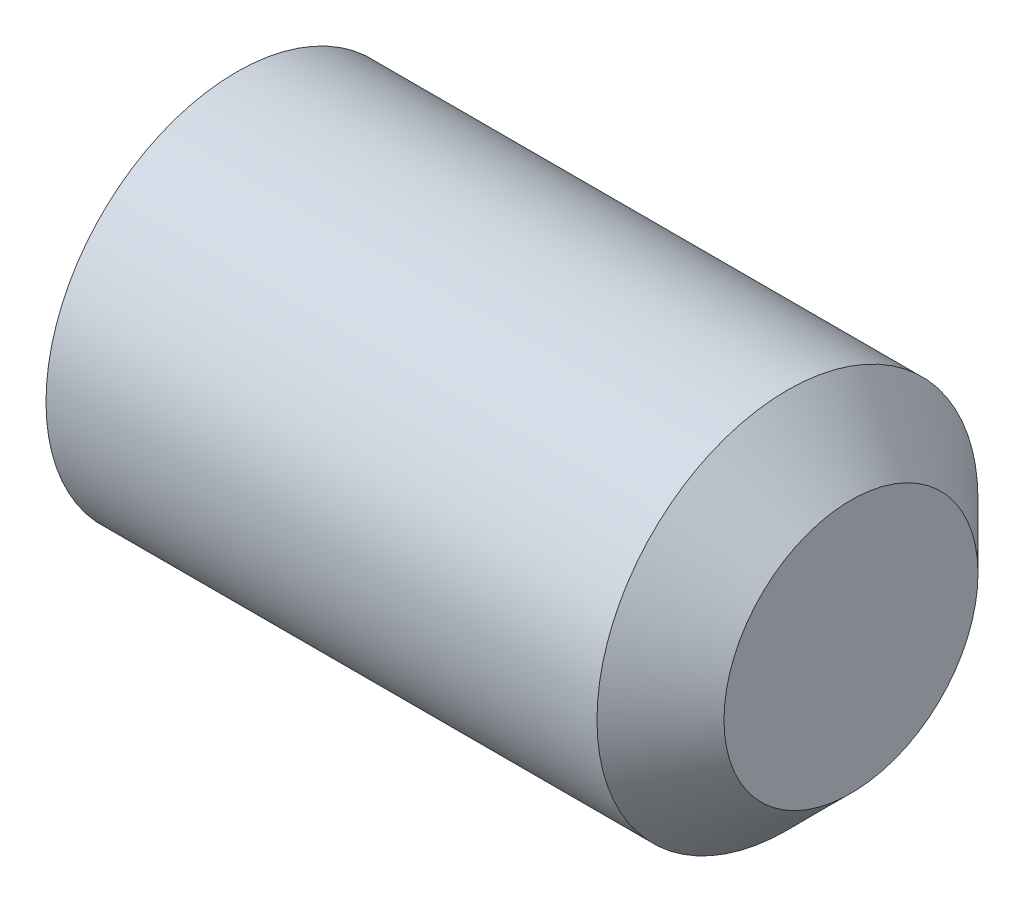
ISO-10303-21;
HEADER;
FILE_DESCRIPTION(('STEP AP214'),'2;1');
FILE_NAME('part.step','',(''),(''),'','','');
FILE_SCHEMA(('AUTOMOTIVE_DESIGN { 1 0 10303 214 1 1 1 1 }'));
ENDSEC;
DATA;
#1=APPLICATION_CONTEXT('core data for automotive mechanical design processes');
#2=APPLICATION_PROTOCOL_DEFINITION('international standard','automotive_design',2000,#1);
#3=PRODUCT_CONTEXT('',#1,'mechanical');
#4=PRODUCT('Part','Part','',(#3));
#5=PRODUCT_RELATED_PRODUCT_CATEGORY('part','',(#4));
#6=PRODUCT_DEFINITION_FORMATION('','',#4);
#7=PRODUCT_DEFINITION_CONTEXT('part definition',#1,'design');
#8=PRODUCT_DEFINITION('design','',#6,#7);
#9=PRODUCT_DEFINITION_SHAPE('','',#8);
#10=(LENGTH_UNIT() NAMED_UNIT(*) SI_UNIT(.MILLI.,.METRE.));
#11=(NAMED_UNIT(*) PLANE_ANGLE_UNIT() SI_UNIT($,.RADIAN.));
#12=(NAMED_UNIT(*) SI_UNIT($,.STERADIAN.) SOLID_ANGLE_UNIT());
#13=UNCERTAINTY_MEASURE_WITH_UNIT(LENGTH_MEASURE(1.E-05),#10,'distance_accuracy_value','');
#14=(GEOMETRIC_REPRESENTATION_CONTEXT(3) GLOBAL_UNCERTAINTY_ASSIGNED_CONTEXT((#13)) GLOBAL_UNIT_ASSIGNED_CONTEXT((#10,
#11,#12)) REPRESENTATION_CONTEXT('',''));
#15=CARTESIAN_POINT('',(0.,0.,0.));
#16=DIRECTION('',(0.,0.,1.));
#17=DIRECTION('',(1.,0.,0.));
#18=AXIS2_PLACEMENT_3D('',#15,#16,#17);
#19=CARTESIAN_POINT('',(0.,0.,0.));
#20=DIRECTION('',(-1.,0.,0.));
#21=DIRECTION('',(0.,0.,1.));
#22=AXIS2_PLACEMENT_3D('',#19,#20,#21);
#23=PLANE('',#22);
#24=CARTESIAN_POINT('',(0.,0.,0.));
#25=DIRECTION('',(-1.,0.,0.));
#26=DIRECTION('',(0.,0.,1.));
#27=AXIS2_PLACEMENT_3D('',#24,#25,#26);
#28=CIRCLE('',#27,1.2195);
#29=CARTESIAN_POINT('',(0.,0.,1.2195));
#30=VERTEX_POINT('',#29);
#31=EDGE_CURVE('E136',#30,#30,#28,.T.);
#32=ORIENTED_EDGE('',*,*,#31,.T.);
#33=EDGE_LOOP('',(#32));
#34=FACE_BOUND('',#33,.T.);
#35=DIRECTION('',(0.,0.,-1.));
#36=VECTOR('',#35,1.);
#37=CARTESIAN_POINT('',(0.,0.750000000000004,0.433012701892216));
#38=LINE('',#37,#36);
#39=CARTESIAN_POINT('',(0.,0.750000000000004,0.433012701892216));
#40=VERTEX_POINT('',#39);
#41=CARTESIAN_POINT('',(0.,0.750000000000003,-0.433012701892223));
#42=VERTEX_POINT('',#41);
#43=EDGE_CURVE('E127',#40,#42,#38,.T.);
#44=ORIENTED_EDGE('',*,*,#43,.F.);
#45=DIRECTION('',(0.,-0.866025403784438,0.5));
#46=VECTOR('',#45,1.);
#47=CARTESIAN_POINT('',(0.,0.750000000000004,0.433012701892216));
#48=LINE('',#47,#46);
#49=CARTESIAN_POINT('',(0.,0.,0.866025403784436));
#50=VERTEX_POINT('',#49);
#51=EDGE_CURVE('E49',#40,#50,#48,.T.);
#52=ORIENTED_EDGE('',*,*,#51,.T.);
#53=DIRECTION('',(0.,0.866025403784439,0.5));
#54=VECTOR('',#53,1.);
#55=CARTESIAN_POINT('',(0.,-0.749999999999997,0.433012701892217));
#56=LINE('',#55,#54);
#57=CARTESIAN_POINT('',(0.,-0.749999999999997,0.433012701892217));
#58=VERTEX_POINT('',#57);
#59=EDGE_CURVE('E118',#58,#50,#56,.T.);
#60=ORIENTED_EDGE('',*,*,#59,.F.);
#61=DIRECTION('',(0.,0.,-1.));
#62=VECTOR('',#61,1.);
#63=CARTESIAN_POINT('',(0.,-0.749999999999997,0.433012701892217));
#64=LINE('',#63,#62);
#65=CARTESIAN_POINT('',(0.,-0.749999999999997,-0.433012701892222));
#66=VERTEX_POINT('',#65);
#67=EDGE_CURVE('E121',#58,#66,#64,.T.);
#68=ORIENTED_EDGE('',*,*,#67,.T.);
#69=DIRECTION('',(0.,0.866025403784438,-0.5));
#70=VECTOR('',#69,1.);
#71=CARTESIAN_POINT('',(0.,-0.749999999999997,-0.433012701892222));
#72=LINE('',#71,#70);
#73=CARTESIAN_POINT('',(0.,0.,-0.866025403784442));
#74=VERTEX_POINT('',#73);
#75=EDGE_CURVE('E124',#66,#74,#72,.T.);
#76=ORIENTED_EDGE('',*,*,#75,.T.);
#77=DIRECTION('',(0.,-0.866025403784439,-0.5));
#78=VECTOR('',#77,1.);
#79=CARTESIAN_POINT('',(0.,0.750000000000003,-0.433012701892223));
#80=LINE('',#79,#78);
#81=EDGE_CURVE('E107',#42,#74,#80,.T.);
#82=ORIENTED_EDGE('',*,*,#81,.F.);
#83=EDGE_LOOP('',(#44,#52,#60,#68,#76,#82));
#84=FACE_BOUND('',#83,.T.);
#85=ADVANCED_FACE('F34',(#34,#84),#23,.T.);
#86=CARTESIAN_POINT('',(5.,1.,0.));
#87=DIRECTION('',(1.,0.,0.));
#88=DIRECTION('',(0.,0.,-1.));
#89=AXIS2_PLACEMENT_3D('',#86,#87,#88);
#90=PLANE('',#89);
#91=CARTESIAN_POINT('',(5.,0.,0.));
#92=DIRECTION('',(-1.,0.,0.));
#93=DIRECTION('',(0.,0.,1.));
#94=AXIS2_PLACEMENT_3D('',#91,#92,#93);
#95=CIRCLE('',#94,1.);
#96=CARTESIAN_POINT('',(5.,0.,1.));
#97=VERTEX_POINT('',#96);
#98=EDGE_CURVE('E11',#97,#97,#95,.T.);
#99=ORIENTED_EDGE('',*,*,#98,.F.);
#100=EDGE_LOOP('',(#99));
#101=FACE_BOUND('',#100,.T.);
#102=ADVANCED_FACE('F36',(#101),#90,.T.);
#103=CARTESIAN_POINT('',(4.5,0.,0.));
#104=DIRECTION('',(-1.,0.,0.));
#105=DIRECTION('',(0.,0.,1.));
#106=AXIS2_PLACEMENT_3D('',#103,#104,#105);
#107=CONICAL_SURFACE('',#106,1.5,0.785398163397452);
#108=ORIENTED_EDGE('',*,*,#98,.T.);
#109=EDGE_LOOP('',(#108));
#110=FACE_BOUND('',#109,.T.);
#111=CARTESIAN_POINT('',(4.5,0.,0.));
#112=DIRECTION('',(-1.,0.,0.));
#113=DIRECTION('',(0.,0.,1.));
#114=AXIS2_PLACEMENT_3D('',#111,#112,#113);
#115=CIRCLE('',#114,1.5);
#116=CARTESIAN_POINT('',(4.5,0.,1.5));
#117=VERTEX_POINT('',#116);
#118=EDGE_CURVE('E42',#117,#117,#115,.T.);
#119=ORIENTED_EDGE('',*,*,#118,.F.);
#120=EDGE_LOOP('',(#119));
#121=FACE_BOUND('',#120,.T.);
#122=ADVANCED_FACE('F147',(#110,#121),#107,.T.);
#123=CARTESIAN_POINT('',(-12.7,0.,0.));
#124=DIRECTION('',(-1.,0.,0.));
#125=DIRECTION('',(0.,0.,1.));
#126=AXIS2_PLACEMENT_3D('',#123,#124,#125);
#127=CYLINDRICAL_SURFACE('',#126,1.5);
#128=ORIENTED_EDGE('',*,*,#118,.T.);
#129=EDGE_LOOP('',(#128));
#130=FACE_BOUND('',#129,.T.);
#131=CARTESIAN_POINT('',(0.161946750507689,0.,0.));
#132=DIRECTION('',(-1.,0.,0.));
#133=DIRECTION('',(0.,0.,1.));
#134=AXIS2_PLACEMENT_3D('',#131,#132,#133);
#135=CIRCLE('',#134,1.5);
#136=CARTESIAN_POINT('',(0.161946750507689,0.,1.5));
#137=VERTEX_POINT('',#136);
#138=EDGE_CURVE('E139',#137,#137,#135,.T.);
#139=ORIENTED_EDGE('',*,*,#138,.F.);
#140=EDGE_LOOP('',(#139));
#141=FACE_BOUND('',#140,.T.);
#142=ADVANCED_FACE('F144',(#130,#141),#127,.T.);
#143=CARTESIAN_POINT('',(0.,0.,0.));
#144=DIRECTION('',(1.,0.,0.));
#145=DIRECTION('',(0.,0.,-1.));
#146=AXIS2_PLACEMENT_3D('',#143,#144,#145);
#147=CONICAL_SURFACE('',#146,1.2195,1.0471975511966);
#148=ORIENTED_EDGE('',*,*,#138,.T.);
#149=EDGE_LOOP('',(#148));
#150=FACE_BOUND('',#149,.T.);
#151=ORIENTED_EDGE('',*,*,#31,.F.);
#152=EDGE_LOOP('',(#151));
#153=FACE_BOUND('',#152,.T.);
#154=ADVANCED_FACE('F154',(#150,#153),#147,.T.);
#155=CARTESIAN_POINT('',(2.1,0.750000000000004,0.433012701892216));
#156=DIRECTION('',(0.,-0.5,-0.866025403784438));
#157=DIRECTION('',(0.,0.866025403784438,-0.5));
#158=AXIS2_PLACEMENT_3D('',#155,#156,#157);
#159=PLANE('',#158);
#160=ORIENTED_EDGE('',*,*,#51,.F.);
#161=DIRECTION('',(-1.,0.,0.));
#162=VECTOR('',#161,1.);
#163=CARTESIAN_POINT('',(2.1,0.750000000000004,0.433012701892216));
#164=LINE('',#163,#162);
#165=CARTESIAN_POINT('',(2.1,0.750000000000004,0.433012701892216));
#166=VERTEX_POINT('',#165);
#167=EDGE_CURVE('E54',#166,#40,#164,.T.);
#168=ORIENTED_EDGE('',*,*,#167,.F.);
#169=DIRECTION('',(0.,-0.866025403784438,0.5));
#170=VECTOR('',#169,1.);
#171=CARTESIAN_POINT('',(2.1,0.750000000000004,0.433012701892216));
#172=LINE('',#171,#170);
#173=CARTESIAN_POINT('',(2.1,0.,0.866025403784436));
#174=VERTEX_POINT('',#173);
#175=EDGE_CURVE('E81',#166,#174,#172,.T.);
#176=ORIENTED_EDGE('',*,*,#175,.T.);
#177=DIRECTION('',(-1.,0.,0.));
#178=VECTOR('',#177,1.);
#179=CARTESIAN_POINT('',(2.1,0.,0.866025403784436));
#180=LINE('',#179,#178);
#181=EDGE_CURVE('E134',#174,#50,#180,.T.);
#182=ORIENTED_EDGE('',*,*,#181,.T.);
#183=EDGE_LOOP('',(#160,#168,#176,#182));
#184=FACE_BOUND('',#183,.T.);
#185=ADVANCED_FACE('F165',(#184),#159,.T.);
#186=CARTESIAN_POINT('',(2.1,-0.749999999999997,0.433012701892217));
#187=DIRECTION('',(0.,-0.5,0.866025403784439));
#188=DIRECTION('',(0.,-0.866025403784439,-0.5));
#189=AXIS2_PLACEMENT_3D('',#186,#187,#188);
#190=PLANE('',#189);
#191=ORIENTED_EDGE('',*,*,#59,.T.);
#192=ORIENTED_EDGE('',*,*,#181,.F.);
#193=DIRECTION('',(0.,0.866025403784439,0.5));
#194=VECTOR('',#193,1.);
#195=CARTESIAN_POINT('',(2.1,-0.749999999999997,0.433012701892217));
#196=LINE('',#195,#194);
#197=CARTESIAN_POINT('',(2.1,-0.749999999999997,0.433012701892217));
#198=VERTEX_POINT('',#197);
#199=EDGE_CURVE('E269',#198,#174,#196,.T.);
#200=ORIENTED_EDGE('',*,*,#199,.F.);
#201=DIRECTION('',(-1.,0.,0.));
#202=VECTOR('',#201,1.);
#203=CARTESIAN_POINT('',(2.1,-0.749999999999997,0.433012701892217));
#204=LINE('',#203,#202);
#205=EDGE_CURVE('E132',#198,#58,#204,.T.);
#206=ORIENTED_EDGE('',*,*,#205,.T.);
#207=EDGE_LOOP('',(#191,#192,#200,#206));
#208=FACE_BOUND('',#207,.T.);
#209=ADVANCED_FACE('F172',(#208),#190,.F.);
#210=CARTESIAN_POINT('',(2.1,-0.749999999999997,0.433012701892217));
#211=DIRECTION('',(0.,1.,0.));
#212=DIRECTION('',(0.,0.,1.));
#213=AXIS2_PLACEMENT_3D('',#210,#211,#212);
#214=PLANE('',#213);
#215=ORIENTED_EDGE('',*,*,#67,.F.);
#216=ORIENTED_EDGE('',*,*,#205,.F.);
#217=DIRECTION('',(0.,0.,-1.));
#218=VECTOR('',#217,1.);
#219=CARTESIAN_POINT('',(2.1,-0.749999999999997,0.433012701892217));
#220=LINE('',#219,#218);
#221=CARTESIAN_POINT('',(2.1,-0.749999999999997,-0.433012701892222));
#222=VERTEX_POINT('',#221);
#223=EDGE_CURVE('E102',#198,#222,#220,.T.);
#224=ORIENTED_EDGE('',*,*,#223,.T.);
#225=DIRECTION('',(-1.,0.,0.));
#226=VECTOR('',#225,1.);
#227=CARTESIAN_POINT('',(2.1,-0.749999999999997,-0.433012701892222));
#228=LINE('',#227,#226);
#229=EDGE_CURVE('E97',#222,#66,#228,.T.);
#230=ORIENTED_EDGE('',*,*,#229,.T.);
#231=EDGE_LOOP('',(#215,#216,#224,#230));
#232=FACE_BOUND('',#231,.T.);
#233=ADVANCED_FACE('F179',(#232),#214,.T.);
#234=CARTESIAN_POINT('',(2.1,-0.749999999999997,-0.433012701892222));
#235=DIRECTION('',(0.,0.5,0.866025403784438));
#236=DIRECTION('',(0.,-0.866025403784438,0.5));
#237=AXIS2_PLACEMENT_3D('',#234,#235,#236);
#238=PLANE('',#237);
#239=ORIENTED_EDGE('',*,*,#75,.F.);
#240=ORIENTED_EDGE('',*,*,#229,.F.);
#241=DIRECTION('',(0.,0.866025403784438,-0.5));
#242=VECTOR('',#241,1.);
#243=CARTESIAN_POINT('',(2.1,-0.749999999999997,-0.433012701892222));
#244=LINE('',#243,#242);
#245=CARTESIAN_POINT('',(2.1,0.,-0.866025403784442));
#246=VERTEX_POINT('',#245);
#247=EDGE_CURVE('E92',#222,#246,#244,.T.);
#248=ORIENTED_EDGE('',*,*,#247,.T.);
#249=DIRECTION('',(-1.,0.,0.));
#250=VECTOR('',#249,1.);
#251=CARTESIAN_POINT('',(2.1,0.,-0.866025403784442));
#252=LINE('',#251,#250);
#253=EDGE_CURVE('E96',#246,#74,#252,.T.);
#254=ORIENTED_EDGE('',*,*,#253,.T.);
#255=EDGE_LOOP('',(#239,#240,#248,#254));
#256=FACE_BOUND('',#255,.T.);
#257=ADVANCED_FACE('F95',(#256),#238,.T.);
#258=CARTESIAN_POINT('',(2.1,0.750000000000003,-0.433012701892223));
#259=DIRECTION('',(0.,0.5,-0.866025403784439));
#260=DIRECTION('',(0.,0.866025403784439,0.5));
#261=AXIS2_PLACEMENT_3D('',#258,#259,#260);
#262=PLANE('',#261);
#263=ORIENTED_EDGE('',*,*,#81,.T.);
#264=ORIENTED_EDGE('',*,*,#253,.F.);
#265=DIRECTION('',(0.,-0.866025403784439,-0.5));
#266=VECTOR('',#265,1.);
#267=CARTESIAN_POINT('',(2.1,0.750000000000003,-0.433012701892223));
#268=LINE('',#267,#266);
#269=CARTESIAN_POINT('',(2.1,0.750000000000003,-0.433012701892223));
#270=VERTEX_POINT('',#269);
#271=EDGE_CURVE('E101',#270,#246,#268,.T.);
#272=ORIENTED_EDGE('',*,*,#271,.F.);
#273=DIRECTION('',(-1.,0.,0.));
#274=VECTOR('',#273,1.);
#275=CARTESIAN_POINT('',(2.1,0.750000000000003,-0.433012701892223));
#276=LINE('',#275,#274);
#277=EDGE_CURVE('E77',#270,#42,#276,.T.);
#278=ORIENTED_EDGE('',*,*,#277,.T.);
#279=EDGE_LOOP('',(#263,#264,#272,#278));
#280=FACE_BOUND('',#279,.T.);
#281=ADVANCED_FACE('F104',(#280),#262,.F.);
#282=CARTESIAN_POINT('',(2.1,0.750000000000004,0.433012701892216));
#283=DIRECTION('',(0.,1.,0.));
#284=DIRECTION('',(0.,0.,1.));
#285=AXIS2_PLACEMENT_3D('',#282,#283,#284);
#286=PLANE('',#285);
#287=ORIENTED_EDGE('',*,*,#43,.T.);
#288=ORIENTED_EDGE('',*,*,#277,.F.);
#289=DIRECTION('',(0.,0.,-1.));
#290=VECTOR('',#289,1.);
#291=CARTESIAN_POINT('',(2.1,0.750000000000004,0.433012701892216));
#292=LINE('',#291,#290);
#293=EDGE_CURVE('E112',#166,#270,#292,.T.);
#294=ORIENTED_EDGE('',*,*,#293,.F.);
#295=ORIENTED_EDGE('',*,*,#167,.T.);
#296=EDGE_LOOP('',(#287,#288,#294,#295));
#297=FACE_BOUND('',#296,.T.);
#298=ADVANCED_FACE('F191',(#297),#286,.F.);
#299=CARTESIAN_POINT('',(2.1,1.5,0.));
#300=DIRECTION('',(1.,0.,0.));
#301=DIRECTION('',(0.,0.,-1.));
#302=AXIS2_PLACEMENT_3D('',#299,#300,#301);
#303=PLANE('',#302);
#304=ORIENTED_EDGE('',*,*,#175,.F.);
#305=ORIENTED_EDGE('',*,*,#293,.T.);
#306=ORIENTED_EDGE('',*,*,#271,.T.);
#307=ORIENTED_EDGE('',*,*,#247,.F.);
#308=ORIENTED_EDGE('',*,*,#223,.F.);
#309=ORIENTED_EDGE('',*,*,#199,.T.);
#310=EDGE_LOOP('',(#304,#305,#306,#307,#308,#309));
#311=FACE_BOUND('',#310,.T.);
#312=ADVANCED_FACE('F110',(#311),#303,.F.);
#313=CLOSED_SHELL('',(#85,#102,#122,#142,#154,#185,#209,#233,#257,#281,#298,#312));
#314=MANIFOLD_SOLID_BREP('B2',#313);
#315=ADVANCED_BREP_SHAPE_REPRESENTATION('',(#18,#314),#14);
#316=SHAPE_DEFINITION_REPRESENTATION(#9,#315);
ENDSEC;
END-ISO-10303-21;
